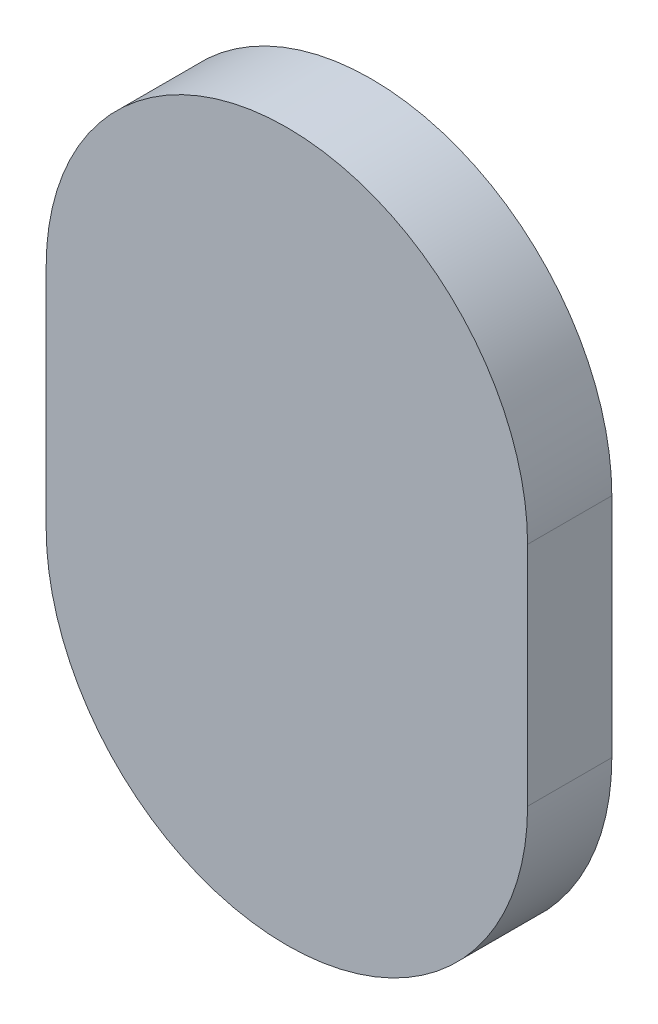
ISO-10303-21;
HEADER;
FILE_DESCRIPTION(('STEP AP214'),'2;1');
FILE_NAME('part.step','',(''),(''),'','','');
FILE_SCHEMA(('AUTOMOTIVE_DESIGN { 1 0 10303 214 1 1 1 1 }'));
ENDSEC;
DATA;
#1=APPLICATION_CONTEXT('core data for automotive mechanical design processes');
#2=APPLICATION_PROTOCOL_DEFINITION('international standard','automotive_design',2000,#1);
#3=PRODUCT_CONTEXT('',#1,'mechanical');
#4=PRODUCT('Part','Part','',(#3));
#5=PRODUCT_RELATED_PRODUCT_CATEGORY('part','',(#4));
#6=PRODUCT_DEFINITION_FORMATION('','',#4);
#7=PRODUCT_DEFINITION_CONTEXT('part definition',#1,'design');
#8=PRODUCT_DEFINITION('design','',#6,#7);
#9=PRODUCT_DEFINITION_SHAPE('','',#8);
#10=(LENGTH_UNIT() NAMED_UNIT(*) SI_UNIT(.MILLI.,.METRE.));
#11=(NAMED_UNIT(*) PLANE_ANGLE_UNIT() SI_UNIT($,.RADIAN.));
#12=(NAMED_UNIT(*) SI_UNIT($,.STERADIAN.) SOLID_ANGLE_UNIT());
#13=UNCERTAINTY_MEASURE_WITH_UNIT(LENGTH_MEASURE(1.E-05),#10,'distance_accuracy_value','');
#14=(GEOMETRIC_REPRESENTATION_CONTEXT(3) GLOBAL_UNCERTAINTY_ASSIGNED_CONTEXT((#13)) GLOBAL_UNIT_ASSIGNED_CONTEXT((#10,
#11,#12)) REPRESENTATION_CONTEXT('',''));
#15=CARTESIAN_POINT('',(0.,0.,0.));
#16=DIRECTION('',(0.,0.,1.));
#17=DIRECTION('',(1.,0.,0.));
#18=AXIS2_PLACEMENT_3D('',#15,#16,#17);
#19=CARTESIAN_POINT('',(88.9,-124.059314,1.635));
#20=DIRECTION('',(0.,0.,1.));
#21=DIRECTION('',(1.,0.,0.));
#22=AXIS2_PLACEMENT_3D('',#19,#20,#21);
#23=PLANE('',#22);
#24=DIRECTION('',(0.,-1.,0.));
#25=VECTOR('',#24,1.);
#26=CARTESIAN_POINT('',(88.9,-124.059314,1.635));
#27=LINE('',#26,#25);
#28=CARTESIAN_POINT('',(88.9,-124.059314,1.635));
#29=VERTEX_POINT('',#28);
#30=CARTESIAN_POINT('',(88.9,-124.153553,1.635));
#31=VERTEX_POINT('',#30);
#32=EDGE_CURVE('E83',#29,#31,#27,.T.);
#33=ORIENTED_EDGE('',*,*,#32,.T.);
#34=CARTESIAN_POINT('',(89.,-124.153553,1.635));
#35=DIRECTION('',(0.,0.,1.));
#36=DIRECTION('',(-1.,0.,0.));
#37=AXIS2_PLACEMENT_3D('',#34,#35,#36);
#38=CIRCLE('',#37,0.09999999999999);
#39=CARTESIAN_POINT('',(89.1,-124.153553,1.635));
#40=VERTEX_POINT('',#39);
#41=EDGE_CURVE('E109',#31,#40,#38,.T.);
#42=ORIENTED_EDGE('',*,*,#41,.T.);
#43=DIRECTION('',(0.,1.,0.));
#44=VECTOR('',#43,1.);
#45=CARTESIAN_POINT('',(89.1,-124.153553,1.635));
#46=LINE('',#45,#44);
#47=CARTESIAN_POINT('',(89.1,-124.059314,1.635));
#48=VERTEX_POINT('',#47);
#49=EDGE_CURVE('E75',#40,#48,#46,.T.);
#50=ORIENTED_EDGE('',*,*,#49,.T.);
#51=CARTESIAN_POINT('',(89.,-124.059314,1.635));
#52=DIRECTION('',(0.,0.,1.));
#53=DIRECTION('',(1.,0.,0.));
#54=AXIS2_PLACEMENT_3D('',#51,#52,#53);
#55=CIRCLE('',#54,0.09999999999999);
#56=EDGE_CURVE('E11',#48,#29,#55,.T.);
#57=ORIENTED_EDGE('',*,*,#56,.T.);
#58=EDGE_LOOP('',(#33,#42,#50,#57));
#59=FACE_BOUND('',#58,.T.);
#60=ADVANCED_FACE('F17',(#59),#23,.T.);
#61=CARTESIAN_POINT('',(88.9,-124.059314,1.6));
#62=DIRECTION('',(0.,0.,1.));
#63=DIRECTION('',(1.,0.,0.));
#64=AXIS2_PLACEMENT_3D('',#61,#62,#63);
#65=PLANE('',#64);
#66=CARTESIAN_POINT('',(89.,-124.059314,1.6));
#67=DIRECTION('',(0.,0.,1.));
#68=DIRECTION('',(1.,0.,0.));
#69=AXIS2_PLACEMENT_3D('',#66,#67,#68);
#70=CIRCLE('',#69,0.09999999999999);
#71=CARTESIAN_POINT('',(89.1,-124.059314,1.6));
#72=VERTEX_POINT('',#71);
#73=CARTESIAN_POINT('',(88.9,-124.059314,1.6));
#74=VERTEX_POINT('',#73);
#75=EDGE_CURVE('E26',#72,#74,#70,.T.);
#76=ORIENTED_EDGE('',*,*,#75,.F.);
#77=DIRECTION('',(0.,1.,0.));
#78=VECTOR('',#77,1.);
#79=CARTESIAN_POINT('',(89.1,-124.153553,1.6));
#80=LINE('',#79,#78);
#81=CARTESIAN_POINT('',(89.1,-124.153553,1.6));
#82=VERTEX_POINT('',#81);
#83=EDGE_CURVE('E106',#82,#72,#80,.T.);
#84=ORIENTED_EDGE('',*,*,#83,.F.);
#85=CARTESIAN_POINT('',(89.,-124.153553,1.6));
#86=DIRECTION('',(0.,0.,1.));
#87=DIRECTION('',(-1.,0.,0.));
#88=AXIS2_PLACEMENT_3D('',#85,#86,#87);
#89=CIRCLE('',#88,0.09999999999999);
#90=CARTESIAN_POINT('',(88.9,-124.153553,1.6));
#91=VERTEX_POINT('',#90);
#92=EDGE_CURVE('E85',#91,#82,#89,.T.);
#93=ORIENTED_EDGE('',*,*,#92,.F.);
#94=DIRECTION('',(0.,-1.,0.));
#95=VECTOR('',#94,1.);
#96=CARTESIAN_POINT('',(88.9,-124.059314,1.6));
#97=LINE('',#96,#95);
#98=EDGE_CURVE('E81',#74,#91,#97,.T.);
#99=ORIENTED_EDGE('',*,*,#98,.F.);
#100=EDGE_LOOP('',(#76,#84,#93,#99));
#101=FACE_BOUND('',#100,.T.);
#102=ADVANCED_FACE('F87',(#101),#65,.F.);
#103=CARTESIAN_POINT('',(89.,-124.059314,1.6));
#104=DIRECTION('',(0.,0.,-1.));
#105=DIRECTION('',(1.,0.,0.));
#106=AXIS2_PLACEMENT_3D('',#103,#104,#105);
#107=CYLINDRICAL_SURFACE('',#106,0.09999999999999);
#108=ORIENTED_EDGE('',*,*,#75,.T.);
#109=DIRECTION('',(0.,0.,1.));
#110=VECTOR('',#109,1.);
#111=CARTESIAN_POINT('',(88.9,-124.059314,1.6));
#112=LINE('',#111,#110);
#113=EDGE_CURVE('E70',#74,#29,#112,.T.);
#114=ORIENTED_EDGE('',*,*,#113,.T.);
#115=ORIENTED_EDGE('',*,*,#56,.F.);
#116=DIRECTION('',(0.,0.,1.));
#117=VECTOR('',#116,1.);
#118=CARTESIAN_POINT('',(89.1,-124.059314,1.6));
#119=LINE('',#118,#117);
#120=EDGE_CURVE('E20',#72,#48,#119,.T.);
#121=ORIENTED_EDGE('',*,*,#120,.F.);
#122=EDGE_LOOP('',(#108,#114,#115,#121));
#123=FACE_BOUND('',#122,.T.);
#124=ADVANCED_FACE('F69',(#123),#107,.T.);
#125=CARTESIAN_POINT('',(89.1,-124.153553,1.6));
#126=DIRECTION('',(-1.,0.,0.));
#127=DIRECTION('',(0.,0.,1.));
#128=AXIS2_PLACEMENT_3D('',#125,#126,#127);
#129=PLANE('',#128);
#130=ORIENTED_EDGE('',*,*,#83,.T.);
#131=ORIENTED_EDGE('',*,*,#120,.T.);
#132=ORIENTED_EDGE('',*,*,#49,.F.);
#133=DIRECTION('',(0.,0.,1.));
#134=VECTOR('',#133,1.);
#135=CARTESIAN_POINT('',(89.1,-124.153553,1.6));
#136=LINE('',#135,#134);
#137=EDGE_CURVE('E103',#82,#40,#136,.T.);
#138=ORIENTED_EDGE('',*,*,#137,.F.);
#139=EDGE_LOOP('',(#130,#131,#132,#138));
#140=FACE_BOUND('',#139,.T.);
#141=ADVANCED_FACE('F121',(#140),#129,.F.);
#142=CARTESIAN_POINT('',(89.,-124.153553,1.6));
#143=DIRECTION('',(0.,0.,-1.));
#144=DIRECTION('',(-1.,0.,0.));
#145=AXIS2_PLACEMENT_3D('',#142,#143,#144);
#146=CYLINDRICAL_SURFACE('',#145,0.09999999999999);
#147=ORIENTED_EDGE('',*,*,#92,.T.);
#148=ORIENTED_EDGE('',*,*,#137,.T.);
#149=ORIENTED_EDGE('',*,*,#41,.F.);
#150=DIRECTION('',(0.,0.,1.));
#151=VECTOR('',#150,1.);
#152=CARTESIAN_POINT('',(88.9,-124.153553,1.6));
#153=LINE('',#152,#151);
#154=EDGE_CURVE('E91',#91,#31,#153,.T.);
#155=ORIENTED_EDGE('',*,*,#154,.F.);
#156=EDGE_LOOP('',(#147,#148,#149,#155));
#157=FACE_BOUND('',#156,.T.);
#158=ADVANCED_FACE('F119',(#157),#146,.T.);
#159=CARTESIAN_POINT('',(88.9,-124.059314,1.6));
#160=DIRECTION('',(1.,0.,0.));
#161=DIRECTION('',(0.,1.,0.));
#162=AXIS2_PLACEMENT_3D('',#159,#160,#161);
#163=PLANE('',#162);
#164=ORIENTED_EDGE('',*,*,#98,.T.);
#165=ORIENTED_EDGE('',*,*,#154,.T.);
#166=ORIENTED_EDGE('',*,*,#32,.F.);
#167=ORIENTED_EDGE('',*,*,#113,.F.);
#168=EDGE_LOOP('',(#164,#165,#166,#167));
#169=FACE_BOUND('',#168,.T.);
#170=ADVANCED_FACE('F79',(#169),#163,.F.);
#171=CLOSED_SHELL('',(#60,#102,#124,#141,#158,#170));
#172=MANIFOLD_SOLID_BREP('B1',#171);
#173=ADVANCED_BREP_SHAPE_REPRESENTATION('',(#18,#172),#14);
#174=SHAPE_DEFINITION_REPRESENTATION(#9,#173);
ENDSEC;
END-ISO-10303-21;
